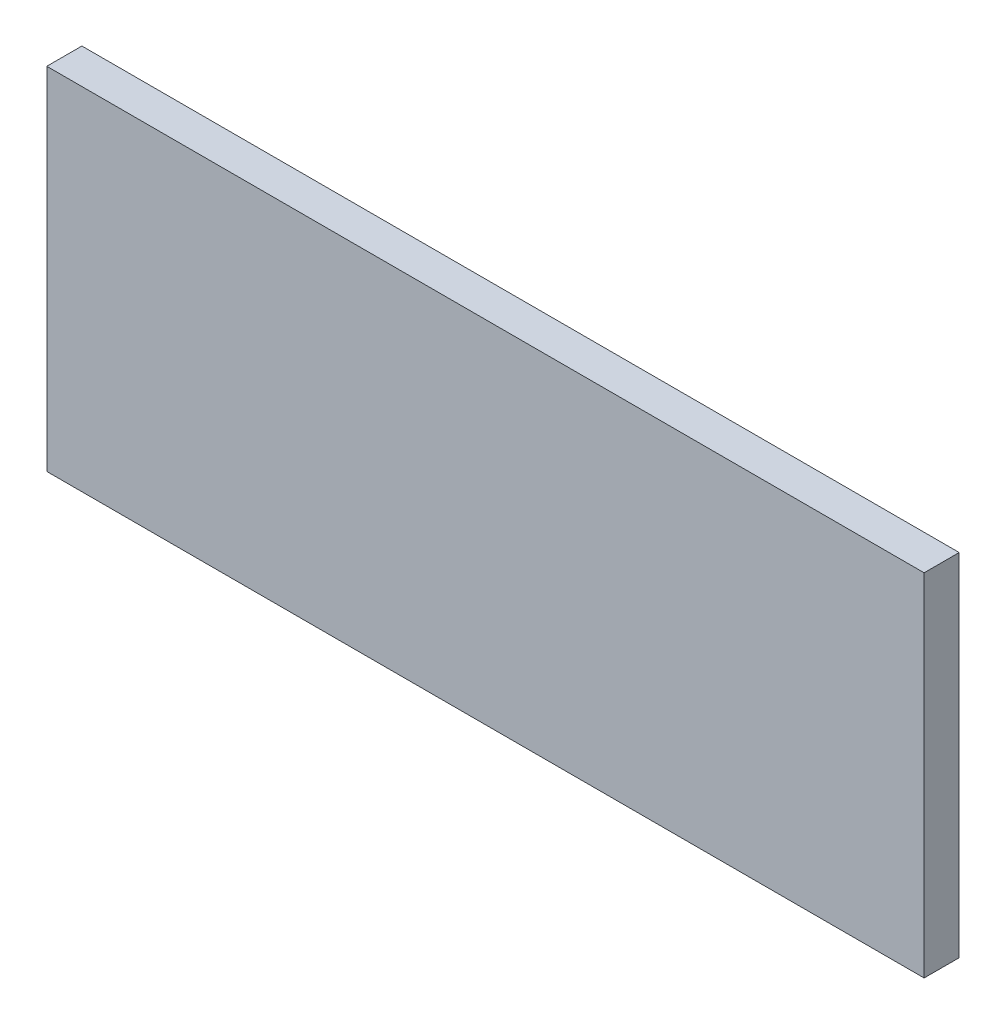
ISO-10303-21;
HEADER;
FILE_DESCRIPTION(('STEP AP214'),'2;1');
FILE_NAME('part.step','',(''),(''),'','','');
FILE_SCHEMA(('AUTOMOTIVE_DESIGN { 1 0 10303 214 1 1 1 1 }'));
ENDSEC;
DATA;
#1=APPLICATION_CONTEXT('core data for automotive mechanical design processes');
#2=APPLICATION_PROTOCOL_DEFINITION('international standard','automotive_design',2000,#1);
#3=PRODUCT_CONTEXT('',#1,'mechanical');
#4=PRODUCT('Part','Part','',(#3));
#5=PRODUCT_RELATED_PRODUCT_CATEGORY('part','',(#4));
#6=PRODUCT_DEFINITION_FORMATION('','',#4);
#7=PRODUCT_DEFINITION_CONTEXT('part definition',#1,'design');
#8=PRODUCT_DEFINITION('design','',#6,#7);
#9=PRODUCT_DEFINITION_SHAPE('','',#8);
#10=(LENGTH_UNIT() NAMED_UNIT(*) SI_UNIT(.MILLI.,.METRE.));
#11=(NAMED_UNIT(*) PLANE_ANGLE_UNIT() SI_UNIT($,.RADIAN.));
#12=(NAMED_UNIT(*) SI_UNIT($,.STERADIAN.) SOLID_ANGLE_UNIT());
#13=UNCERTAINTY_MEASURE_WITH_UNIT(LENGTH_MEASURE(1.E-05),#10,'distance_accuracy_value','');
#14=(GEOMETRIC_REPRESENTATION_CONTEXT(3) GLOBAL_UNCERTAINTY_ASSIGNED_CONTEXT((#13)) GLOBAL_UNIT_ASSIGNED_CONTEXT((#10,
#11,#12)) REPRESENTATION_CONTEXT('',''));
#15=CARTESIAN_POINT('',(0.,0.,0.));
#16=DIRECTION('',(0.,0.,1.));
#17=DIRECTION('',(1.,0.,0.));
#18=AXIS2_PLACEMENT_3D('',#15,#16,#17);
#19=CARTESIAN_POINT('',(25.,10.,2.));
#20=DIRECTION('',(-1.,0.,0.));
#21=DIRECTION('',(0.,-1.,0.));
#22=AXIS2_PLACEMENT_3D('',#19,#20,#21);
#23=PLANE('',#22);
#24=DIRECTION('',(0.,1.,0.));
#25=VECTOR('',#24,1.);
#26=CARTESIAN_POINT('',(25.,10.,0.));
#27=LINE('',#26,#25);
#28=CARTESIAN_POINT('',(25.,-10.,0.));
#29=VERTEX_POINT('',#28);
#30=CARTESIAN_POINT('',(25.,10.,0.));
#31=VERTEX_POINT('',#30);
#32=EDGE_CURVE('E107',#29,#31,#27,.T.);
#33=ORIENTED_EDGE('',*,*,#32,.T.);
#34=DIRECTION('',(0.,0.,-1.));
#35=VECTOR('',#34,1.);
#36=CARTESIAN_POINT('',(25.,10.,2.));
#37=LINE('',#36,#35);
#38=CARTESIAN_POINT('',(25.,10.,2.));
#39=VERTEX_POINT('',#38);
#40=EDGE_CURVE('E11',#39,#31,#37,.T.);
#41=ORIENTED_EDGE('',*,*,#40,.F.);
#42=DIRECTION('',(0.,1.,0.));
#43=VECTOR('',#42,1.);
#44=CARTESIAN_POINT('',(25.,10.,2.));
#45=LINE('',#44,#43);
#46=CARTESIAN_POINT('',(25.,-10.,2.));
#47=VERTEX_POINT('',#46);
#48=EDGE_CURVE('E91',#47,#39,#45,.T.);
#49=ORIENTED_EDGE('',*,*,#48,.F.);
#50=DIRECTION('',(0.,0.,-1.));
#51=VECTOR('',#50,1.);
#52=CARTESIAN_POINT('',(25.,-10.,2.));
#53=LINE('',#52,#51);
#54=EDGE_CURVE('E103',#47,#29,#53,.T.);
#55=ORIENTED_EDGE('',*,*,#54,.T.);
#56=EDGE_LOOP('',(#33,#41,#49,#55));
#57=FACE_BOUND('',#56,.T.);
#58=ADVANCED_FACE('F39',(#57),#23,.F.);
#59=CARTESIAN_POINT('',(-25.,10.,2.));
#60=DIRECTION('',(0.,-1.,0.));
#61=DIRECTION('',(0.,0.,-1.));
#62=AXIS2_PLACEMENT_3D('',#59,#60,#61);
#63=PLANE('',#62);
#64=DIRECTION('',(-1.,0.,0.));
#65=VECTOR('',#64,1.);
#66=CARTESIAN_POINT('',(-25.,10.,0.));
#67=LINE('',#66,#65);
#68=CARTESIAN_POINT('',(-25.,10.,0.));
#69=VERTEX_POINT('',#68);
#70=EDGE_CURVE('E96',#31,#69,#67,.T.);
#71=ORIENTED_EDGE('',*,*,#70,.T.);
#72=DIRECTION('',(0.,0.,-1.));
#73=VECTOR('',#72,1.);
#74=CARTESIAN_POINT('',(-25.,10.,2.));
#75=LINE('',#74,#73);
#76=CARTESIAN_POINT('',(-25.,10.,2.));
#77=VERTEX_POINT('',#76);
#78=EDGE_CURVE('E48',#77,#69,#75,.T.);
#79=ORIENTED_EDGE('',*,*,#78,.F.);
#80=DIRECTION('',(-1.,0.,0.));
#81=VECTOR('',#80,1.);
#82=CARTESIAN_POINT('',(-25.,10.,2.));
#83=LINE('',#82,#81);
#84=EDGE_CURVE('E86',#39,#77,#83,.T.);
#85=ORIENTED_EDGE('',*,*,#84,.F.);
#86=ORIENTED_EDGE('',*,*,#40,.T.);
#87=EDGE_LOOP('',(#71,#79,#85,#86));
#88=FACE_BOUND('',#87,.T.);
#89=ADVANCED_FACE('F95',(#88),#63,.F.);
#90=CARTESIAN_POINT('',(-25.,10.,2.));
#91=DIRECTION('',(1.,0.,0.));
#92=DIRECTION('',(0.,1.,0.));
#93=AXIS2_PLACEMENT_3D('',#90,#91,#92);
#94=PLANE('',#93);
#95=DIRECTION('',(0.,-1.,0.));
#96=VECTOR('',#95,1.);
#97=CARTESIAN_POINT('',(-25.,10.,0.));
#98=LINE('',#97,#96);
#99=CARTESIAN_POINT('',(-25.,-10.,0.));
#100=VERTEX_POINT('',#99);
#101=EDGE_CURVE('E73',#69,#100,#98,.T.);
#102=ORIENTED_EDGE('',*,*,#101,.T.);
#103=DIRECTION('',(0.,0.,-1.));
#104=VECTOR('',#103,1.);
#105=CARTESIAN_POINT('',(-25.,-10.,2.));
#106=LINE('',#105,#104);
#107=CARTESIAN_POINT('',(-25.,-10.,2.));
#108=VERTEX_POINT('',#107);
#109=EDGE_CURVE('E98',#108,#100,#106,.T.);
#110=ORIENTED_EDGE('',*,*,#109,.F.);
#111=DIRECTION('',(0.,-1.,0.));
#112=VECTOR('',#111,1.);
#113=CARTESIAN_POINT('',(-25.,10.,2.));
#114=LINE('',#113,#112);
#115=EDGE_CURVE('E89',#77,#108,#114,.T.);
#116=ORIENTED_EDGE('',*,*,#115,.F.);
#117=ORIENTED_EDGE('',*,*,#78,.T.);
#118=EDGE_LOOP('',(#102,#110,#116,#117));
#119=FACE_BOUND('',#118,.T.);
#120=ADVANCED_FACE('F99',(#119),#94,.F.);
#121=CARTESIAN_POINT('',(-25.,-10.,2.));
#122=DIRECTION('',(0.,1.,0.));
#123=DIRECTION('',(0.,0.,1.));
#124=AXIS2_PLACEMENT_3D('',#121,#122,#123);
#125=PLANE('',#124);
#126=DIRECTION('',(1.,0.,0.));
#127=VECTOR('',#126,1.);
#128=CARTESIAN_POINT('',(-25.,-10.,0.));
#129=LINE('',#128,#127);
#130=EDGE_CURVE('E79',#100,#29,#129,.T.);
#131=ORIENTED_EDGE('',*,*,#130,.T.);
#132=ORIENTED_EDGE('',*,*,#54,.F.);
#133=DIRECTION('',(1.,0.,0.));
#134=VECTOR('',#133,1.);
#135=CARTESIAN_POINT('',(-25.,-10.,2.));
#136=LINE('',#135,#134);
#137=EDGE_CURVE('E56',#108,#47,#136,.T.);
#138=ORIENTED_EDGE('',*,*,#137,.F.);
#139=ORIENTED_EDGE('',*,*,#109,.T.);
#140=EDGE_LOOP('',(#131,#132,#138,#139));
#141=FACE_BOUND('',#140,.T.);
#142=ADVANCED_FACE('F120',(#141),#125,.F.);
#143=CARTESIAN_POINT('',(0.,0.,2.));
#144=DIRECTION('',(0.,0.,1.));
#145=DIRECTION('',(1.,0.,0.));
#146=AXIS2_PLACEMENT_3D('',#143,#144,#145);
#147=PLANE('',#146);
#148=ORIENTED_EDGE('',*,*,#48,.T.);
#149=ORIENTED_EDGE('',*,*,#84,.T.);
#150=ORIENTED_EDGE('',*,*,#115,.T.);
#151=ORIENTED_EDGE('',*,*,#137,.T.);
#152=EDGE_LOOP('',(#148,#149,#150,#151));
#153=FACE_BOUND('',#152,.T.);
#154=ADVANCED_FACE('F87',(#153),#147,.T.);
#155=CARTESIAN_POINT('',(0.,0.,0.));
#156=DIRECTION('',(0.,0.,1.));
#157=DIRECTION('',(1.,0.,0.));
#158=AXIS2_PLACEMENT_3D('',#155,#156,#157);
#159=PLANE('',#158);
#160=ORIENTED_EDGE('',*,*,#32,.F.);
#161=ORIENTED_EDGE('',*,*,#130,.F.);
#162=ORIENTED_EDGE('',*,*,#101,.F.);
#163=ORIENTED_EDGE('',*,*,#70,.F.);
#164=EDGE_LOOP('',(#160,#161,#162,#163));
#165=FACE_BOUND('',#164,.T.);
#166=ADVANCED_FACE('F123',(#165),#159,.F.);
#167=CLOSED_SHELL('',(#58,#89,#120,#142,#154,#166));
#168=MANIFOLD_SOLID_BREP('B2',#167);
#169=ADVANCED_BREP_SHAPE_REPRESENTATION('',(#18,#168),#14);
#170=SHAPE_DEFINITION_REPRESENTATION(#9,#169);
ENDSEC;
END-ISO-10303-21;
